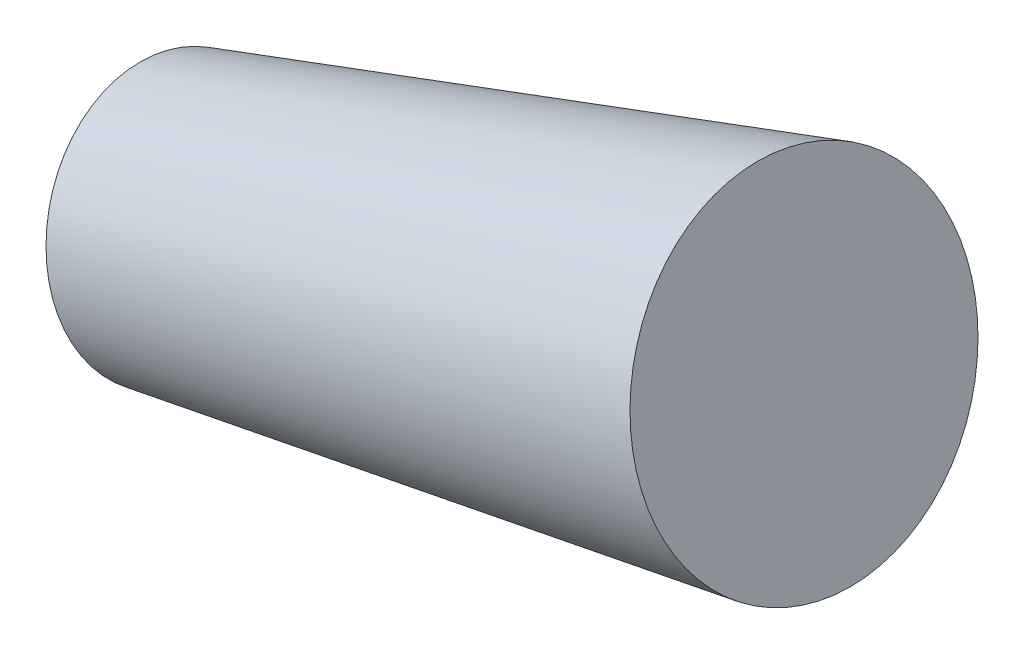
ISO-10303-21;
HEADER;
FILE_DESCRIPTION(('STEP AP214'),'2;1');
FILE_NAME('part.step','',(''),(''),'','','');
FILE_SCHEMA(('AUTOMOTIVE_DESIGN { 1 0 10303 214 1 1 1 1 }'));
ENDSEC;
DATA;
#1=APPLICATION_CONTEXT('core data for automotive mechanical design processes');
#2=APPLICATION_PROTOCOL_DEFINITION('international standard','automotive_design',2000,#1);
#3=PRODUCT_CONTEXT('',#1,'mechanical');
#4=PRODUCT('Part','Part','',(#3));
#5=PRODUCT_RELATED_PRODUCT_CATEGORY('part','',(#4));
#6=PRODUCT_DEFINITION_FORMATION('','',#4);
#7=PRODUCT_DEFINITION_CONTEXT('part definition',#1,'design');
#8=PRODUCT_DEFINITION('design','',#6,#7);
#9=PRODUCT_DEFINITION_SHAPE('','',#8);
#10=(LENGTH_UNIT() NAMED_UNIT(*) SI_UNIT(.MILLI.,.METRE.));
#11=(NAMED_UNIT(*) PLANE_ANGLE_UNIT() SI_UNIT($,.RADIAN.));
#12=(NAMED_UNIT(*) SI_UNIT($,.STERADIAN.) SOLID_ANGLE_UNIT());
#13=UNCERTAINTY_MEASURE_WITH_UNIT(LENGTH_MEASURE(1.E-05),#10,'distance_accuracy_value','');
#14=(GEOMETRIC_REPRESENTATION_CONTEXT(3) GLOBAL_UNCERTAINTY_ASSIGNED_CONTEXT((#13)) GLOBAL_UNIT_ASSIGNED_CONTEXT((#10,
#11,#12)) REPRESENTATION_CONTEXT('',''));
#15=CARTESIAN_POINT('',(0.,0.,0.));
#16=DIRECTION('',(0.,0.,1.));
#17=DIRECTION('',(1.,0.,0.));
#18=AXIS2_PLACEMENT_3D('',#15,#16,#17);
#19=CARTESIAN_POINT('',(12.9383677243995,22.9208878704837,0.));
#20=DIRECTION('',(-0.961261695938319,-0.275637355816999,0.));
#21=DIRECTION('',(0.275637355816999,-0.961261695938319,0.));
#22=AXIS2_PLACEMENT_3D('',#19,#20,#21);
#23=PLANE('',#22);
#24=CARTESIAN_POINT('',(12.9383677243995,22.9208878704837,0.));
#25=DIRECTION('',(-0.961261695938319,-0.275637355816999,0.));
#26=DIRECTION('',(0.275637355816999,-0.961261695938319,0.));
#27=AXIS2_PLACEMENT_3D('',#24,#25,#26);
#28=CIRCLE('',#27,3.125);
#29=CARTESIAN_POINT('',(13.7997344613277,19.9169450706764,0.));
#30=VERTEX_POINT('',#29);
#31=EDGE_CURVE('E10',#30,#30,#28,.T.);
#32=ORIENTED_EDGE('',*,*,#31,.F.);
#33=EDGE_LOOP('',(#32));
#34=FACE_BOUND('',#33,.T.);
#35=ADVANCED_FACE('F15',(#34),#23,.F.);
#36=CARTESIAN_POINT('',(12.9383677243995,22.9208878704837,0.));
#37=DIRECTION('',(0.961261695938319,0.275637355816999,0.));
#38=DIRECTION('',(-0.275637355816999,0.961261695938319,0.));
#39=AXIS2_PLACEMENT_3D('',#36,#37,#38);
#40=CONICAL_SURFACE('',#39,3.125,0.0668984702289429);
#41=CARTESIAN_POINT('',(1.21097503395206,19.5581121295163,0.));
#42=DIRECTION('',(-0.961261695938319,-0.275637355816999,0.));
#43=DIRECTION('',(0.275637355816999,-0.961261695938319,0.));
#44=AXIS2_PLACEMENT_3D('',#41,#42,#43);
#45=CIRCLE('',#44,2.30761892870857);
#46=CARTESIAN_POINT('',(1.84704101369454,17.3398864445265,0.));
#47=VERTEX_POINT('',#46);
#48=EDGE_CURVE('E21',#47,#47,#45,.T.);
#49=ORIENTED_EDGE('',*,*,#48,.F.);
#50=EDGE_LOOP('',(#49));
#51=FACE_BOUND('',#50,.T.);
#52=ORIENTED_EDGE('',*,*,#31,.T.);
#53=EDGE_LOOP('',(#52));
#54=FACE_BOUND('',#53,.T.);
#55=ADVANCED_FACE('F29',(#51,#54),#40,.T.);
#56=CARTESIAN_POINT('',(1.84704101369454,17.3398864445265,0.));
#57=DIRECTION('',(0.961261695938319,0.275637355816999,0.));
#58=DIRECTION('',(-0.275637355816999,0.961261695938319,0.));
#59=AXIS2_PLACEMENT_3D('',#56,#57,#58);
#60=PLANE('',#59);
#61=ORIENTED_EDGE('',*,*,#48,.T.);
#62=EDGE_LOOP('',(#61));
#63=FACE_BOUND('',#62,.T.);
#64=ADVANCED_FACE('F27',(#63),#60,.F.);
#65=CLOSED_SHELL('',(#35,#55,#64));
#66=MANIFOLD_SOLID_BREP('B1',#65);
#67=ADVANCED_BREP_SHAPE_REPRESENTATION('',(#18,#66),#14);
#68=SHAPE_DEFINITION_REPRESENTATION(#9,#67);
ENDSEC;
END-ISO-10303-21;
